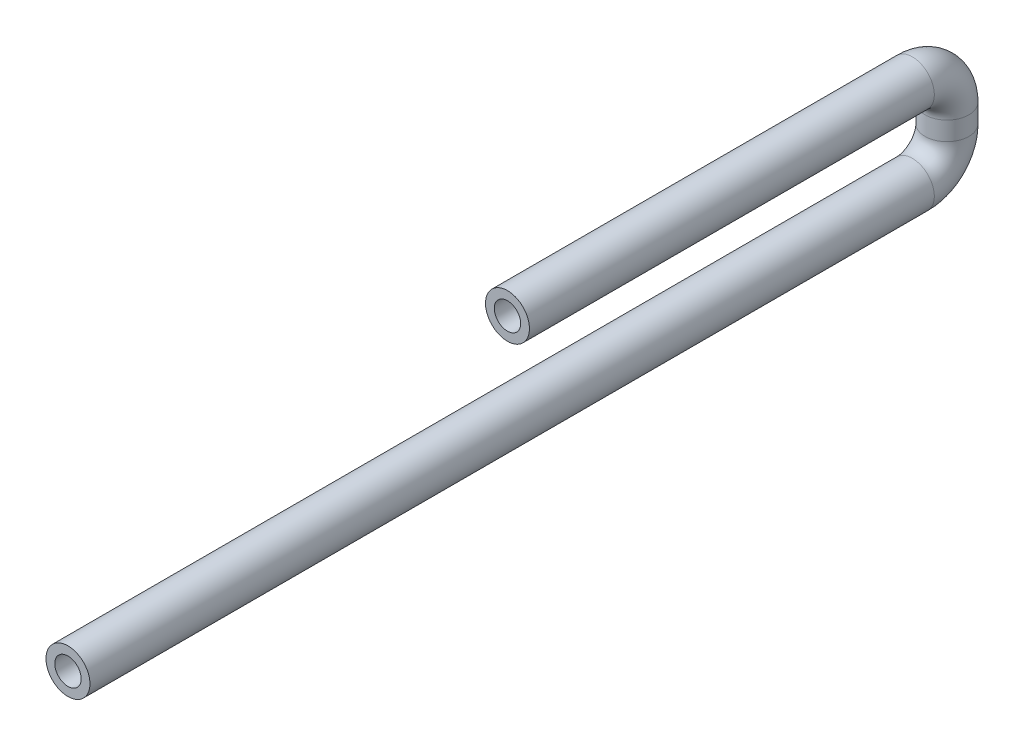
ISO-10303-21;
HEADER;
FILE_DESCRIPTION(('STEP AP214'),'2;1');
FILE_NAME('part.step','',(''),(''),'','','');
FILE_SCHEMA(('AUTOMOTIVE_DESIGN { 1 0 10303 214 1 1 1 1 }'));
ENDSEC;
DATA;
#1=APPLICATION_CONTEXT('core data for automotive mechanical design processes');
#2=APPLICATION_PROTOCOL_DEFINITION('international standard','automotive_design',2000,#1);
#3=PRODUCT_CONTEXT('',#1,'mechanical');
#4=PRODUCT('Part','Part','',(#3));
#5=PRODUCT_RELATED_PRODUCT_CATEGORY('part','',(#4));
#6=PRODUCT_DEFINITION_FORMATION('','',#4);
#7=PRODUCT_DEFINITION_CONTEXT('part definition',#1,'design');
#8=PRODUCT_DEFINITION('design','',#6,#7);
#9=PRODUCT_DEFINITION_SHAPE('','',#8);
#10=(LENGTH_UNIT() NAMED_UNIT(*) SI_UNIT(.MILLI.,.METRE.));
#11=(NAMED_UNIT(*) PLANE_ANGLE_UNIT() SI_UNIT($,.RADIAN.));
#12=(NAMED_UNIT(*) SI_UNIT($,.STERADIAN.) SOLID_ANGLE_UNIT());
#13=UNCERTAINTY_MEASURE_WITH_UNIT(LENGTH_MEASURE(1.E-05),#10,'distance_accuracy_value','');
#14=(GEOMETRIC_REPRESENTATION_CONTEXT(3) GLOBAL_UNCERTAINTY_ASSIGNED_CONTEXT((#13)) GLOBAL_UNIT_ASSIGNED_CONTEXT((#10,
#11,#12)) REPRESENTATION_CONTEXT('',''));
#15=CARTESIAN_POINT('',(0.,0.,0.));
#16=DIRECTION('',(0.,0.,1.));
#17=DIRECTION('',(1.,0.,0.));
#18=AXIS2_PLACEMENT_3D('',#15,#16,#17);
#19=CARTESIAN_POINT('',(-0.830212590030313,-5.18321914316221,0.));
#20=DIRECTION('',(0.,0.,-1.));
#21=DIRECTION('',(-1.,0.,0.));
#22=AXIS2_PLACEMENT_3D('',#19,#20,#21);
#23=CYLINDRICAL_SURFACE('',#22,6.35);
#24=CARTESIAN_POINT('',(-0.830212590030313,-5.18321914316221,-117.));
#25=DIRECTION('',(0.,0.,1.));
#26=DIRECTION('',(1.,0.,0.));
#27=AXIS2_PLACEMENT_3D('',#24,#25,#26);
#28=CIRCLE('',#27,6.35);
#29=CARTESIAN_POINT('',(-0.830212590030313,1.16678085683779,-117.));
#30=VERTEX_POINT('',#29);
#31=EDGE_CURVE('E128',#30,#30,#28,.T.);
#32=ORIENTED_EDGE('',*,*,#31,.T.);
#33=EDGE_LOOP('',(#32));
#34=FACE_BOUND('',#33,.T.);
#35=CARTESIAN_POINT('',(-0.830212590030313,-5.18321914316221,0.));
#36=DIRECTION('',(0.,0.,1.));
#37=DIRECTION('',(1.,0.,0.));
#38=AXIS2_PLACEMENT_3D('',#35,#36,#37);
#39=CIRCLE('',#38,6.35);
#40=CARTESIAN_POINT('',(5.51978740996969,-5.18321914316221,0.));
#41=VERTEX_POINT('',#40);
#42=EDGE_CURVE('E55',#41,#41,#39,.T.);
#43=ORIENTED_EDGE('',*,*,#42,.F.);
#44=EDGE_LOOP('',(#43));
#45=FACE_BOUND('',#44,.T.);
#46=ADVANCED_FACE('F39',(#34,#45),#23,.T.);
#47=CARTESIAN_POINT('',(-0.830212590030313,-15.1832191431622,-117.));
#48=DIRECTION('',(-1.,0.,0.));
#49=DIRECTION('',(0.,0.,1.));
#50=AXIS2_PLACEMENT_3D('',#47,#48,#49);
#51=TOROIDAL_SURFACE('',#50,10.,6.35);
#52=CARTESIAN_POINT('',(-0.830212590030313,-15.1832191431622,-127.));
#53=DIRECTION('',(0.,1.,0.));
#54=DIRECTION('',(1.,0.,0.));
#55=AXIS2_PLACEMENT_3D('',#52,#53,#54);
#56=CIRCLE('',#55,6.35);
#57=CARTESIAN_POINT('',(-0.830212590030313,-15.1832191431622,-133.35));
#58=VERTEX_POINT('',#57);
#59=EDGE_CURVE('E132',#58,#58,#56,.T.);
#60=CARTESIAN_POINT('',(-0.830212590030313,-15.1832191431622,-117.));
#61=DIRECTION('',(-1.,0.,0.));
#62=DIRECTION('',(0.,0.,1.));
#63=AXIS2_PLACEMENT_3D('',#60,#61,#62);
#64=CIRCLE('',#63,16.35);
#65=EDGE_CURVE('',#30,#58,#64,.T.);
#66=ORIENTED_EDGE('',*,*,#31,.F.);
#67=ORIENTED_EDGE('',*,*,#59,.T.);
#68=ORIENTED_EDGE('',*,*,#65,.T.);
#69=ORIENTED_EDGE('',*,*,#65,.F.);
#70=EDGE_LOOP('',(#66,#68,#67,#69));
#71=FACE_BOUND('',#70,.T.);
#72=ADVANCED_FACE('F156',(#71),#51,.T.);
#73=CARTESIAN_POINT('',(-0.830212590030313,-15.1832191431623,-127.));
#74=DIRECTION('',(0.,-1.,0.));
#75=DIRECTION('',(0.,0.,-1.));
#76=AXIS2_PLACEMENT_3D('',#73,#74,#75);
#77=CYLINDRICAL_SURFACE('',#76,6.35);
#78=CARTESIAN_POINT('',(-0.830212590030313,-20.5832191431621,-127.));
#79=DIRECTION('',(0.,1.,0.));
#80=DIRECTION('',(1.,0.,0.));
#81=AXIS2_PLACEMENT_3D('',#78,#79,#80);
#82=CIRCLE('',#81,6.35);
#83=CARTESIAN_POINT('',(-0.830212590030313,-20.5832191431621,-133.35));
#84=VERTEX_POINT('',#83);
#85=EDGE_CURVE('E135',#84,#84,#82,.T.);
#86=ORIENTED_EDGE('',*,*,#85,.T.);
#87=EDGE_LOOP('',(#86));
#88=FACE_BOUND('',#87,.T.);
#89=ORIENTED_EDGE('',*,*,#59,.F.);
#90=EDGE_LOOP('',(#89));
#91=FACE_BOUND('',#90,.T.);
#92=ADVANCED_FACE('F152',(#88,#91),#77,.T.);
#93=CARTESIAN_POINT('',(-0.830212590030313,-20.5832191431622,-117.));
#94=DIRECTION('',(-1.,0.,0.));
#95=DIRECTION('',(0.,0.,1.));
#96=AXIS2_PLACEMENT_3D('',#93,#94,#95);
#97=TOROIDAL_SURFACE('',#96,9.99999999999999,6.35);
#98=CARTESIAN_POINT('',(-0.830212590030313,-30.5832191431622,-117.));
#99=DIRECTION('',(0.,0.,-1.));
#100=DIRECTION('',(1.,0.,0.));
#101=AXIS2_PLACEMENT_3D('',#98,#99,#100);
#102=CIRCLE('',#101,6.35);
#103=CARTESIAN_POINT('',(-0.830212590030313,-36.9332191431622,-117.));
#104=VERTEX_POINT('',#103);
#105=EDGE_CURVE('E43',#104,#104,#102,.T.);
#106=CARTESIAN_POINT('',(-0.830212590030313,-20.5832191431622,-117.));
#107=DIRECTION('',(-1.,0.,0.));
#108=DIRECTION('',(0.,0.,1.));
#109=AXIS2_PLACEMENT_3D('',#106,#107,#108);
#110=CIRCLE('',#109,16.35);
#111=EDGE_CURVE('',#84,#104,#110,.T.);
#112=ORIENTED_EDGE('',*,*,#85,.F.);
#113=ORIENTED_EDGE('',*,*,#105,.T.);
#114=ORIENTED_EDGE('',*,*,#111,.T.);
#115=ORIENTED_EDGE('',*,*,#111,.F.);
#116=EDGE_LOOP('',(#112,#114,#113,#115));
#117=FACE_BOUND('',#116,.T.);
#118=ADVANCED_FACE('F144',(#117),#97,.T.);
#119=CARTESIAN_POINT('',(-0.830212590030313,-30.5832191431622,-117.));
#120=DIRECTION('',(0.,0.,1.));
#121=DIRECTION('',(0.,-1.,0.));
#122=AXIS2_PLACEMENT_3D('',#119,#120,#121);
#123=CYLINDRICAL_SURFACE('',#122,6.35);
#124=CARTESIAN_POINT('',(-0.830212590030313,-30.5832191431622,127.));
#125=DIRECTION('',(0.,0.,-1.));
#126=DIRECTION('',(1.,0.,0.));
#127=AXIS2_PLACEMENT_3D('',#124,#125,#126);
#128=CIRCLE('',#127,6.35);
#129=CARTESIAN_POINT('',(5.51978740996969,-30.5832191431622,127.));
#130=VERTEX_POINT('',#129);
#131=EDGE_CURVE('E60',#130,#130,#128,.T.);
#132=ORIENTED_EDGE('',*,*,#131,.T.);
#133=EDGE_LOOP('',(#132));
#134=FACE_BOUND('',#133,.T.);
#135=ORIENTED_EDGE('',*,*,#105,.F.);
#136=EDGE_LOOP('',(#135));
#137=FACE_BOUND('',#136,.T.);
#138=ADVANCED_FACE('F41',(#134,#137),#123,.T.);
#139=CARTESIAN_POINT('',(-0.830212590030313,-5.18321914316221,0.));
#140=DIRECTION('',(0.,0.,1.));
#141=DIRECTION('',(1.,0.,0.));
#142=AXIS2_PLACEMENT_3D('',#139,#140,#141);
#143=PLANE('',#142);
#144=CARTESIAN_POINT('',(-0.830212590030313,-5.18321914316221,0.));
#145=DIRECTION('',(0.,0.,1.));
#146=DIRECTION('',(1.,0.,0.));
#147=AXIS2_PLACEMENT_3D('',#144,#145,#146);
#148=CIRCLE('',#147,3.81);
#149=CARTESIAN_POINT('',(2.97978740996969,-5.18321914316221,0.));
#150=VERTEX_POINT('',#149);
#151=EDGE_CURVE('E109',#150,#150,#148,.F.);
#152=ORIENTED_EDGE('',*,*,#151,.T.);
#153=EDGE_LOOP('',(#152));
#154=FACE_BOUND('',#153,.T.);
#155=ORIENTED_EDGE('',*,*,#42,.T.);
#156=EDGE_LOOP('',(#155));
#157=FACE_BOUND('',#156,.T.);
#158=ADVANCED_FACE('F73',(#154,#157),#143,.T.);
#159=CARTESIAN_POINT('',(-0.830212590030313,-30.5832191431622,127.));
#160=DIRECTION('',(0.,0.,-1.));
#161=DIRECTION('',(1.,0.,0.));
#162=AXIS2_PLACEMENT_3D('',#159,#160,#161);
#163=PLANE('',#162);
#164=CARTESIAN_POINT('',(-0.830212590030313,-30.5832191431622,127.));
#165=DIRECTION('',(0.,0.,-1.));
#166=DIRECTION('',(1.,0.,0.));
#167=AXIS2_PLACEMENT_3D('',#164,#165,#166);
#168=CIRCLE('',#167,3.81);
#169=CARTESIAN_POINT('',(2.97978740996969,-30.5832191431622,127.));
#170=VERTEX_POINT('',#169);
#171=EDGE_CURVE('E11',#170,#170,#168,.F.);
#172=ORIENTED_EDGE('',*,*,#171,.F.);
#173=EDGE_LOOP('',(#172));
#174=FACE_BOUND('',#173,.T.);
#175=ORIENTED_EDGE('',*,*,#131,.F.);
#176=EDGE_LOOP('',(#175));
#177=FACE_BOUND('',#176,.T.);
#178=ADVANCED_FACE('F70',(#174,#177),#163,.F.);
#179=CARTESIAN_POINT('',(-0.830212590030313,-5.18321914316221,0.));
#180=DIRECTION('',(0.,0.,-1.));
#181=DIRECTION('',(-1.,0.,0.));
#182=AXIS2_PLACEMENT_3D('',#179,#180,#181);
#183=CYLINDRICAL_SURFACE('',#182,3.81);
#184=CARTESIAN_POINT('',(-0.830212590030313,-5.18321914316221,-117.));
#185=DIRECTION('',(0.,0.,1.));
#186=DIRECTION('',(1.,0.,0.));
#187=AXIS2_PLACEMENT_3D('',#184,#185,#186);
#188=CIRCLE('',#187,3.81);
#189=CARTESIAN_POINT('',(-0.830212590030313,-1.37321914316221,-117.));
#190=VERTEX_POINT('',#189);
#191=EDGE_CURVE('E107',#190,#190,#188,.F.);
#192=ORIENTED_EDGE('',*,*,#191,.T.);
#193=EDGE_LOOP('',(#192));
#194=FACE_BOUND('',#193,.T.);
#195=ORIENTED_EDGE('',*,*,#151,.F.);
#196=EDGE_LOOP('',(#195));
#197=FACE_BOUND('',#196,.T.);
#198=ADVANCED_FACE('F72',(#194,#197),#183,.F.);
#199=CARTESIAN_POINT('',(-0.830212590030313,-15.1832191431622,-117.));
#200=DIRECTION('',(-1.,0.,0.));
#201=DIRECTION('',(0.,0.,1.));
#202=AXIS2_PLACEMENT_3D('',#199,#200,#201);
#203=TOROIDAL_SURFACE('',#202,10.,3.81);
#204=CARTESIAN_POINT('',(-0.830212590030313,-15.1832191431622,-127.));
#205=DIRECTION('',(0.,1.,0.));
#206=DIRECTION('',(1.,0.,0.));
#207=AXIS2_PLACEMENT_3D('',#204,#205,#206);
#208=CIRCLE('',#207,3.81);
#209=CARTESIAN_POINT('',(-0.830212590030313,-15.1832191431622,-130.81));
#210=VERTEX_POINT('',#209);
#211=EDGE_CURVE('E104',#210,#210,#208,.F.);
#212=CARTESIAN_POINT('',(-0.830212590030313,-15.1832191431622,-117.));
#213=DIRECTION('',(-1.,0.,0.));
#214=DIRECTION('',(0.,0.,1.));
#215=AXIS2_PLACEMENT_3D('',#212,#213,#214);
#216=CIRCLE('',#215,13.81);
#217=EDGE_CURVE('',#190,#210,#216,.T.);
#218=ORIENTED_EDGE('',*,*,#191,.F.);
#219=ORIENTED_EDGE('',*,*,#211,.T.);
#220=ORIENTED_EDGE('',*,*,#217,.T.);
#221=ORIENTED_EDGE('',*,*,#217,.F.);
#222=EDGE_LOOP('',(#218,#220,#219,#221));
#223=FACE_BOUND('',#222,.T.);
#224=ADVANCED_FACE('F79',(#223),#203,.F.);
#225=CARTESIAN_POINT('',(-0.830212590030313,-15.1832191431623,-127.));
#226=DIRECTION('',(0.,-1.,0.));
#227=DIRECTION('',(0.,0.,-1.));
#228=AXIS2_PLACEMENT_3D('',#225,#226,#227);
#229=CYLINDRICAL_SURFACE('',#228,3.81);
#230=CARTESIAN_POINT('',(-0.830212590030313,-20.5832191431621,-127.));
#231=DIRECTION('',(0.,1.,0.));
#232=DIRECTION('',(1.,0.,0.));
#233=AXIS2_PLACEMENT_3D('',#230,#231,#232);
#234=CIRCLE('',#233,3.81);
#235=CARTESIAN_POINT('',(-0.830212590030313,-20.5832191431621,-130.81));
#236=VERTEX_POINT('',#235);
#237=EDGE_CURVE('E113',#236,#236,#234,.F.);
#238=ORIENTED_EDGE('',*,*,#237,.T.);
#239=EDGE_LOOP('',(#238));
#240=FACE_BOUND('',#239,.T.);
#241=ORIENTED_EDGE('',*,*,#211,.F.);
#242=EDGE_LOOP('',(#241));
#243=FACE_BOUND('',#242,.T.);
#244=ADVANCED_FACE('F90',(#240,#243),#229,.F.);
#245=CARTESIAN_POINT('',(-0.830212590030313,-20.5832191431622,-117.));
#246=DIRECTION('',(-1.,0.,0.));
#247=DIRECTION('',(0.,0.,1.));
#248=AXIS2_PLACEMENT_3D('',#245,#246,#247);
#249=TOROIDAL_SURFACE('',#248,9.99999999999999,3.81);
#250=CARTESIAN_POINT('',(-0.830212590030313,-30.5832191431622,-117.));
#251=DIRECTION('',(0.,0.,-1.));
#252=DIRECTION('',(1.,0.,0.));
#253=AXIS2_PLACEMENT_3D('',#250,#251,#252);
#254=CIRCLE('',#253,3.81);
#255=CARTESIAN_POINT('',(-0.830212590030313,-34.3932191431622,-117.));
#256=VERTEX_POINT('',#255);
#257=EDGE_CURVE('E49',#256,#256,#254,.F.);
#258=CARTESIAN_POINT('',(-0.830212590030313,-20.5832191431622,-117.));
#259=DIRECTION('',(-1.,0.,0.));
#260=DIRECTION('',(0.,0.,1.));
#261=AXIS2_PLACEMENT_3D('',#258,#259,#260);
#262=CIRCLE('',#261,13.81);
#263=EDGE_CURVE('',#236,#256,#262,.T.);
#264=ORIENTED_EDGE('',*,*,#237,.F.);
#265=ORIENTED_EDGE('',*,*,#257,.T.);
#266=ORIENTED_EDGE('',*,*,#263,.T.);
#267=ORIENTED_EDGE('',*,*,#263,.F.);
#268=EDGE_LOOP('',(#264,#266,#265,#267));
#269=FACE_BOUND('',#268,.T.);
#270=ADVANCED_FACE('F86',(#269),#249,.F.);
#271=CARTESIAN_POINT('',(-0.830212590030313,-30.5832191431622,-117.));
#272=DIRECTION('',(0.,0.,1.));
#273=DIRECTION('',(0.,-1.,0.));
#274=AXIS2_PLACEMENT_3D('',#271,#272,#273);
#275=CYLINDRICAL_SURFACE('',#274,3.81);
#276=ORIENTED_EDGE('',*,*,#171,.T.);
#277=EDGE_LOOP('',(#276));
#278=FACE_BOUND('',#277,.T.);
#279=ORIENTED_EDGE('',*,*,#257,.F.);
#280=EDGE_LOOP('',(#279));
#281=FACE_BOUND('',#280,.T.);
#282=ADVANCED_FACE('F67',(#278,#281),#275,.F.);
#283=CLOSED_SHELL('',(#46,#72,#92,#118,#138,#158,#178,#198,#224,#244,#270,#282));
#284=MANIFOLD_SOLID_BREP('B2',#283);
#285=ADVANCED_BREP_SHAPE_REPRESENTATION('',(#18,#284),#14);
#286=SHAPE_DEFINITION_REPRESENTATION(#9,#285);
ENDSEC;
END-ISO-10303-21;
